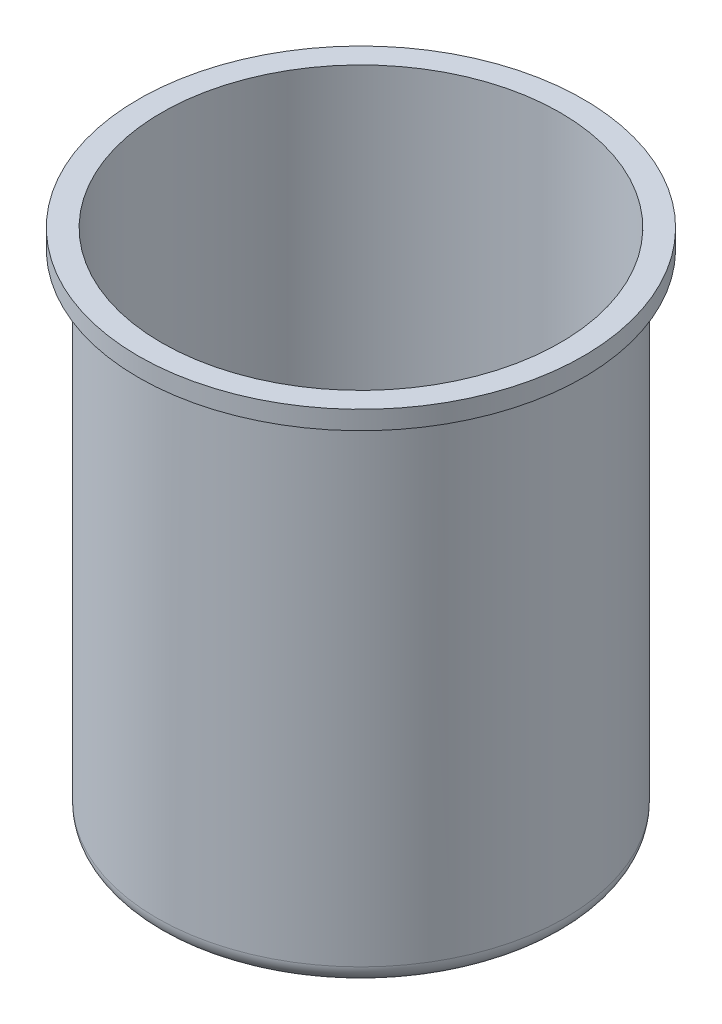
ISO-10303-21;
HEADER;
FILE_DESCRIPTION(('STEP AP214'),'2;1');
FILE_NAME('part.step','',(''),(''),'','','');
FILE_SCHEMA(('AUTOMOTIVE_DESIGN { 1 0 10303 214 1 1 1 1 }'));
ENDSEC;
DATA;
#1=APPLICATION_CONTEXT('core data for automotive mechanical design processes');
#2=APPLICATION_PROTOCOL_DEFINITION('international standard','automotive_design',2000,#1);
#3=PRODUCT_CONTEXT('',#1,'mechanical');
#4=PRODUCT('Part','Part','',(#3));
#5=PRODUCT_RELATED_PRODUCT_CATEGORY('part','',(#4));
#6=PRODUCT_DEFINITION_FORMATION('','',#4);
#7=PRODUCT_DEFINITION_CONTEXT('part definition',#1,'design');
#8=PRODUCT_DEFINITION('design','',#6,#7);
#9=PRODUCT_DEFINITION_SHAPE('','',#8);
#10=(LENGTH_UNIT() NAMED_UNIT(*) SI_UNIT(.MILLI.,.METRE.));
#11=(NAMED_UNIT(*) PLANE_ANGLE_UNIT() SI_UNIT($,.RADIAN.));
#12=(NAMED_UNIT(*) SI_UNIT($,.STERADIAN.) SOLID_ANGLE_UNIT());
#13=UNCERTAINTY_MEASURE_WITH_UNIT(LENGTH_MEASURE(1.E-05),#10,'distance_accuracy_value','');
#14=(GEOMETRIC_REPRESENTATION_CONTEXT(3) GLOBAL_UNCERTAINTY_ASSIGNED_CONTEXT((#13)) GLOBAL_UNIT_ASSIGNED_CONTEXT((#10,
#11,#12)) REPRESENTATION_CONTEXT('',''));
#15=CARTESIAN_POINT('',(0.,0.,0.));
#16=DIRECTION('',(0.,0.,1.));
#17=DIRECTION('',(1.,0.,0.));
#18=AXIS2_PLACEMENT_3D('',#15,#16,#17);
#19=CARTESIAN_POINT('',(0.,679.45,0.));
#20=DIRECTION('',(0.,1.,0.));
#21=DIRECTION('',(0.,0.,1.));
#22=AXIS2_PLACEMENT_3D('',#19,#20,#21);
#23=CYLINDRICAL_SURFACE('',#22,304.8);
#24=CARTESIAN_POINT('',(0.,679.45,0.));
#25=DIRECTION('',(0.,1.,0.));
#26=DIRECTION('',(0.,0.,1.));
#27=AXIS2_PLACEMENT_3D('',#24,#25,#26);
#28=CIRCLE('',#27,304.8);
#29=CARTESIAN_POINT('',(0.,679.45,304.8));
#30=VERTEX_POINT('',#29);
#31=EDGE_CURVE('E48',#30,#30,#28,.T.);
#32=ORIENTED_EDGE('',*,*,#31,.T.);
#33=EDGE_LOOP('',(#32));
#34=FACE_BOUND('',#33,.T.);
#35=CARTESIAN_POINT('',(0.,704.85,0.));
#36=DIRECTION('',(0.,1.,0.));
#37=DIRECTION('',(0.,0.,1.));
#38=AXIS2_PLACEMENT_3D('',#35,#36,#37);
#39=CIRCLE('',#38,304.8);
#40=CARTESIAN_POINT('',(0.,704.85,304.8));
#41=VERTEX_POINT('',#40);
#42=EDGE_CURVE('E51',#41,#41,#39,.T.);
#43=ORIENTED_EDGE('',*,*,#42,.F.);
#44=EDGE_LOOP('',(#43));
#45=FACE_BOUND('',#44,.T.);
#46=ADVANCED_FACE('F33',(#34,#45),#23,.T.);
#47=CARTESIAN_POINT('',(0.,679.45,0.));
#48=DIRECTION('',(0.,1.,0.));
#49=DIRECTION('',(0.,0.,1.));
#50=AXIS2_PLACEMENT_3D('',#47,#48,#49);
#51=PLANE('',#50);
#52=CARTESIAN_POINT('',(0.,679.45,0.));
#53=DIRECTION('',(0.,-1.,0.));
#54=DIRECTION('',(0.,0.,-1.));
#55=AXIS2_PLACEMENT_3D('',#52,#53,#54);
#56=CIRCLE('',#55,292.1);
#57=CARTESIAN_POINT('',(0.,679.45,-292.1));
#58=VERTEX_POINT('',#57);
#59=EDGE_CURVE('E60',#58,#58,#56,.T.);
#60=ORIENTED_EDGE('',*,*,#59,.F.);
#61=EDGE_LOOP('',(#60));
#62=FACE_BOUND('',#61,.T.);
#63=ORIENTED_EDGE('',*,*,#31,.F.);
#64=EDGE_LOOP('',(#63));
#65=FACE_BOUND('',#64,.T.);
#66=ADVANCED_FACE('F85',(#62,#65),#51,.F.);
#67=CARTESIAN_POINT('',(0.,704.85,0.));
#68=DIRECTION('',(0.,1.,0.));
#69=DIRECTION('',(0.,0.,1.));
#70=AXIS2_PLACEMENT_3D('',#67,#68,#69);
#71=PLANE('',#70);
#72=CARTESIAN_POINT('',(0.,704.85,0.));
#73=DIRECTION('',(0.,1.,0.));
#74=DIRECTION('',(0.,0.,1.));
#75=AXIS2_PLACEMENT_3D('',#72,#73,#74);
#76=CIRCLE('',#75,273.05);
#77=CARTESIAN_POINT('',(0.,704.85,273.05));
#78=VERTEX_POINT('',#77);
#79=EDGE_CURVE('E54',#78,#78,#76,.T.);
#80=ORIENTED_EDGE('',*,*,#79,.F.);
#81=EDGE_LOOP('',(#80));
#82=FACE_BOUND('',#81,.T.);
#83=ORIENTED_EDGE('',*,*,#42,.T.);
#84=EDGE_LOOP('',(#83));
#85=FACE_BOUND('',#84,.T.);
#86=ADVANCED_FACE('F88',(#82,#85),#71,.T.);
#87=CARTESIAN_POINT('',(0.,81.28,0.));
#88=DIRECTION('',(0.,1.,0.));
#89=DIRECTION('',(0.,0.,1.));
#90=AXIS2_PLACEMENT_3D('',#87,#88,#89);
#91=PLANE('',#90);
#92=CARTESIAN_POINT('',(0.,81.28,0.));
#93=DIRECTION('',(0.,1.,0.));
#94=DIRECTION('',(0.,0.,1.));
#95=AXIS2_PLACEMENT_3D('',#92,#93,#94);
#96=CIRCLE('',#95,273.05);
#97=CARTESIAN_POINT('',(0.,81.28,273.05));
#98=VERTEX_POINT('',#97);
#99=EDGE_CURVE('E44',#98,#98,#96,.T.);
#100=ORIENTED_EDGE('',*,*,#99,.T.);
#101=EDGE_LOOP('',(#100));
#102=FACE_BOUND('',#101,.T.);
#103=ADVANCED_FACE('F98',(#102),#91,.T.);
#104=CARTESIAN_POINT('',(0.,81.28,0.));
#105=DIRECTION('',(0.,1.,0.));
#106=DIRECTION('',(0.,0.,1.));
#107=AXIS2_PLACEMENT_3D('',#104,#105,#106);
#108=CYLINDRICAL_SURFACE('',#107,273.05);
#109=CARTESIAN_POINT('',(0.,81.28,273.05));
#110=CARTESIAN_POINT('',(0.,87.7755208333333,273.05));
#111=CARTESIAN_POINT('',(0.,94.2710416666667,273.05));
#112=CARTESIAN_POINT('',(0.,107.262083333333,273.05));
#113=CARTESIAN_POINT('',(0.,113.757604166667,273.05));
#114=CARTESIAN_POINT('',(0.,126.748645833333,273.05));
#115=CARTESIAN_POINT('',(0.,133.244166666667,273.05));
#116=CARTESIAN_POINT('',(0.,146.235208333333,273.05));
#117=CARTESIAN_POINT('',(0.,152.730729166667,273.05));
#118=CARTESIAN_POINT('',(0.,165.721770833333,273.05));
#119=CARTESIAN_POINT('',(0.,172.217291666667,273.05));
#120=CARTESIAN_POINT('',(0.,185.208333333333,273.05));
#121=CARTESIAN_POINT('',(0.,191.703854166667,273.05));
#122=CARTESIAN_POINT('',(0.,204.694895833333,273.05));
#123=CARTESIAN_POINT('',(0.,211.190416666667,273.05));
#124=CARTESIAN_POINT('',(0.,224.181458333333,273.05));
#125=CARTESIAN_POINT('',(0.,230.676979166667,273.05));
#126=CARTESIAN_POINT('',(0.,243.668020833333,273.05));
#127=CARTESIAN_POINT('',(0.,250.163541666667,273.05));
#128=CARTESIAN_POINT('',(0.,263.154583333333,273.05));
#129=CARTESIAN_POINT('',(0.,269.650104166667,273.05));
#130=CARTESIAN_POINT('',(0.,282.641145833333,273.05));
#131=CARTESIAN_POINT('',(0.,289.136666666667,273.05));
#132=CARTESIAN_POINT('',(0.,302.127708333333,273.05));
#133=CARTESIAN_POINT('',(0.,308.623229166667,273.05));
#134=CARTESIAN_POINT('',(0.,321.614270833333,273.05));
#135=CARTESIAN_POINT('',(0.,328.109791666667,273.05));
#136=CARTESIAN_POINT('',(0.,341.100833333333,273.05));
#137=CARTESIAN_POINT('',(0.,347.596354166667,273.05));
#138=CARTESIAN_POINT('',(0.,360.587395833333,273.05));
#139=CARTESIAN_POINT('',(0.,367.082916666667,273.05));
#140=CARTESIAN_POINT('',(0.,380.073958333333,273.05));
#141=CARTESIAN_POINT('',(0.,386.569479166667,273.05));
#142=CARTESIAN_POINT('',(0.,399.560520833333,273.05));
#143=CARTESIAN_POINT('',(0.,406.056041666667,273.05));
#144=CARTESIAN_POINT('',(0.,419.047083333333,273.05));
#145=CARTESIAN_POINT('',(0.,425.542604166667,273.05));
#146=CARTESIAN_POINT('',(0.,438.533645833333,273.05));
#147=CARTESIAN_POINT('',(0.,445.029166666667,273.05));
#148=CARTESIAN_POINT('',(0.,458.020208333333,273.05));
#149=CARTESIAN_POINT('',(0.,464.515729166667,273.05));
#150=CARTESIAN_POINT('',(0.,477.506770833333,273.05));
#151=CARTESIAN_POINT('',(0.,484.002291666667,273.05));
#152=CARTESIAN_POINT('',(0.,496.993333333333,273.05));
#153=CARTESIAN_POINT('',(0.,503.488854166667,273.05));
#154=CARTESIAN_POINT('',(0.,516.479895833333,273.05));
#155=CARTESIAN_POINT('',(0.,522.975416666667,273.05));
#156=CARTESIAN_POINT('',(0.,535.966458333333,273.05));
#157=CARTESIAN_POINT('',(0.,542.461979166667,273.05));
#158=CARTESIAN_POINT('',(0.,555.453020833333,273.05));
#159=CARTESIAN_POINT('',(0.,561.948541666667,273.05));
#160=CARTESIAN_POINT('',(0.,574.939583333333,273.05));
#161=CARTESIAN_POINT('',(0.,581.435104166667,273.05));
#162=CARTESIAN_POINT('',(0.,594.426145833333,273.05));
#163=CARTESIAN_POINT('',(0.,600.921666666667,273.05));
#164=CARTESIAN_POINT('',(0.,613.912708333333,273.05));
#165=CARTESIAN_POINT('',(0.,620.408229166667,273.05));
#166=CARTESIAN_POINT('',(0.,633.399270833333,273.05));
#167=CARTESIAN_POINT('',(0.,639.894791666666,273.05));
#168=CARTESIAN_POINT('',(0.,652.885833333333,273.05));
#169=CARTESIAN_POINT('',(0.,659.381354166667,273.05));
#170=CARTESIAN_POINT('',(0.,672.372395833333,273.05));
#171=CARTESIAN_POINT('',(0.,678.867916666666,273.05));
#172=CARTESIAN_POINT('',(0.,691.858958333333,273.05));
#173=CARTESIAN_POINT('',(0.,698.354479166666,273.05));
#174=CARTESIAN_POINT('',(0.,704.85,273.05));
#175=B_SPLINE_CURVE_WITH_KNOTS('',3,(#109,#110,#111,#112,#113,#114,#115,#116,#117,#118,#119,
#120,#121,#122,#123,#124,#125,#126,#127,#128,#129,#130,#131,#132,#133,#134,#135,#136,#137,#138,
#139,#140,#141,#142,#143,#144,#145,#146,#147,#148,#149,#150,#151,#152,#153,#154,#155,#156,#157,
#158,#159,#160,#161,#162,#163,#164,#165,#166,#167,#168,#169,#170,#171,#172,#173,#174),
.UNSPECIFIED.,.F.,.F.,(4,2,2,2,2,2,2,2,2,2,2,2,2,2,2,2,2,2,2,2,2,2,2,2,2,2,2,2,2,2,2,2,4),(0.,
19.4865625,38.973125,58.4596875,77.94625,97.4328125,116.919375,136.4059375,155.8925,175.3790625,
194.865625,214.3521875,233.83875,253.3253125,272.811875,292.2984375,311.785,331.2715625,
350.758125,370.2446875,389.73125,409.2178125,428.704375,448.1909375,467.6775,487.1640625,
506.650625,526.1371875,545.62375,565.1103125,584.596875,604.0834375,623.57),.UNSPECIFIED.);
#176=EDGE_CURVE('BSEAM81',#98,#78,#175,.T.);
#177=ORIENTED_EDGE('',*,*,#99,.F.);
#178=ORIENTED_EDGE('',*,*,#79,.T.);
#179=ORIENTED_EDGE('',*,*,#176,.T.);
#180=ORIENTED_EDGE('',*,*,#176,.F.);
#181=EDGE_LOOP('',(#177,#179,#178,#180));
#182=FACE_BOUND('',#181,.T.);
#183=ADVANCED_FACE('F81',(#182),#108,.F.);
#184=CARTESIAN_POINT('',(0.,692.15,0.));
#185=DIRECTION('',(0.,-1.,0.));
#186=DIRECTION('',(0.,0.,-1.));
#187=AXIS2_PLACEMENT_3D('',#184,#185,#186);
#188=CYLINDRICAL_SURFACE('',#187,292.1);
#189=CARTESIAN_POINT('',(0.,692.15,0.));
#190=DIRECTION('',(0.,-1.,0.));
#191=DIRECTION('',(0.,0.,-1.));
#192=AXIS2_PLACEMENT_3D('',#189,#190,#191);
#193=CIRCLE('',#192,292.1);
#194=CARTESIAN_POINT('',(0.,692.15,-292.1));
#195=VERTEX_POINT('',#194);
#196=EDGE_CURVE('E59',#195,#195,#193,.T.);
#197=ORIENTED_EDGE('',*,*,#196,.F.);
#198=EDGE_LOOP('',(#197));
#199=FACE_BOUND('',#198,.T.);
#200=ORIENTED_EDGE('',*,*,#59,.T.);
#201=EDGE_LOOP('',(#200));
#202=FACE_BOUND('',#201,.T.);
#203=ADVANCED_FACE('F75',(#199,#202),#188,.F.);
#204=CARTESIAN_POINT('',(0.,692.15,0.));
#205=DIRECTION('',(0.,-1.,0.));
#206=DIRECTION('',(0.,0.,-1.));
#207=AXIS2_PLACEMENT_3D('',#204,#205,#206);
#208=PLANE('',#207);
#209=CARTESIAN_POINT('',(0.,692.15,0.));
#210=DIRECTION('',(0.,-1.,0.));
#211=DIRECTION('',(0.,0.,-1.));
#212=AXIS2_PLACEMENT_3D('',#209,#210,#211);
#213=CIRCLE('',#212,279.4);
#214=CARTESIAN_POINT('',(0.,692.15,-279.4));
#215=VERTEX_POINT('',#214);
#216=EDGE_CURVE('E63',#215,#215,#213,.T.);
#217=ORIENTED_EDGE('',*,*,#216,.F.);
#218=EDGE_LOOP('',(#217));
#219=FACE_BOUND('',#218,.T.);
#220=ORIENTED_EDGE('',*,*,#196,.T.);
#221=EDGE_LOOP('',(#220));
#222=FACE_BOUND('',#221,.T.);
#223=ADVANCED_FACE('F71',(#219,#222),#208,.T.);
#224=CARTESIAN_POINT('',(0.,0.,0.));
#225=DIRECTION('',(0.,1.,0.));
#226=DIRECTION('',(0.,0.,1.));
#227=AXIS2_PLACEMENT_3D('',#224,#225,#226);
#228=PLANE('',#227);
#229=CARTESIAN_POINT('',(0.,0.,0.));
#230=DIRECTION('',(0.,1.,0.));
#231=DIRECTION('',(0.,0.,1.));
#232=AXIS2_PLACEMENT_3D('',#229,#230,#231);
#233=CIRCLE('',#232,254.);
#234=CARTESIAN_POINT('',(0.,0.,254.));
#235=VERTEX_POINT('',#234);
#236=EDGE_CURVE('E10',#235,#235,#233,.F.);
#237=ORIENTED_EDGE('',*,*,#236,.T.);
#238=EDGE_LOOP('',(#237));
#239=FACE_BOUND('',#238,.T.);
#240=ADVANCED_FACE('F74',(#239),#228,.F.);
#241=CARTESIAN_POINT('',(0.,25.4,0.));
#242=DIRECTION('',(0.,1.,0.));
#243=DIRECTION('',(0.,0.,1.));
#244=AXIS2_PLACEMENT_3D('',#241,#242,#243);
#245=TOROIDAL_SURFACE('',#244,254.,25.4);
#246=ORIENTED_EDGE('',*,*,#236,.F.);
#247=EDGE_LOOP('',(#246));
#248=FACE_BOUND('',#247,.T.);
#249=CARTESIAN_POINT('',(0.,25.4,0.));
#250=DIRECTION('',(0.,1.,0.));
#251=DIRECTION('',(0.,0.,1.));
#252=AXIS2_PLACEMENT_3D('',#249,#250,#251);
#253=CIRCLE('',#252,279.4);
#254=CARTESIAN_POINT('',(0.,25.4,279.4));
#255=VERTEX_POINT('',#254);
#256=EDGE_CURVE('E40',#255,#255,#253,.T.);
#257=ORIENTED_EDGE('',*,*,#256,.F.);
#258=EDGE_LOOP('',(#257));
#259=FACE_BOUND('',#258,.T.);
#260=ADVANCED_FACE('F35',(#248,#259),#245,.T.);
#261=CARTESIAN_POINT('',(0.,12.7,0.));
#262=DIRECTION('',(0.,-1.,0.));
#263=DIRECTION('',(0.,0.,-1.));
#264=AXIS2_PLACEMENT_3D('',#261,#262,#263);
#265=CYLINDRICAL_SURFACE('',#264,279.4);
#266=ORIENTED_EDGE('',*,*,#256,.T.);
#267=EDGE_LOOP('',(#266));
#268=FACE_BOUND('',#267,.T.);
#269=ORIENTED_EDGE('',*,*,#216,.T.);
#270=EDGE_LOOP('',(#269));
#271=FACE_BOUND('',#270,.T.);
#272=ADVANCED_FACE('F69',(#268,#271),#265,.T.);
#273=CLOSED_SHELL('',(#46,#66,#86,#103,#183,#203,#223,#240,#260,#272));
#274=MANIFOLD_SOLID_BREP('B2',#273);
#275=ADVANCED_BREP_SHAPE_REPRESENTATION('',(#18,#274),#14);
#276=SHAPE_DEFINITION_REPRESENTATION(#9,#275);
ENDSEC;
END-ISO-10303-21;
